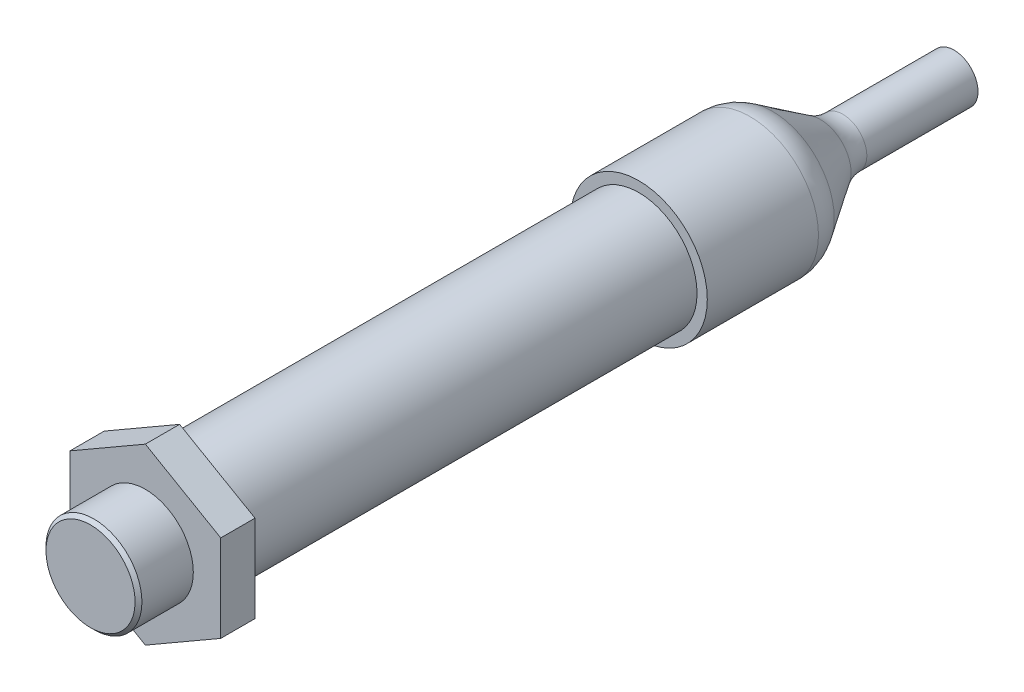
ISO-10303-21;
HEADER;
FILE_DESCRIPTION(('STEP AP214'),'2;1');
FILE_NAME('part.step','',(''),(''),'','','');
FILE_SCHEMA(('AUTOMOTIVE_DESIGN { 1 0 10303 214 1 1 1 1 }'));
ENDSEC;
DATA;
#1=APPLICATION_CONTEXT('core data for automotive mechanical design processes');
#2=APPLICATION_PROTOCOL_DEFINITION('international standard','automotive_design',2000,#1);
#3=PRODUCT_CONTEXT('',#1,'mechanical');
#4=PRODUCT('Part','Part','',(#3));
#5=PRODUCT_RELATED_PRODUCT_CATEGORY('part','',(#4));
#6=PRODUCT_DEFINITION_FORMATION('','',#4);
#7=PRODUCT_DEFINITION_CONTEXT('part definition',#1,'design');
#8=PRODUCT_DEFINITION('design','',#6,#7);
#9=PRODUCT_DEFINITION_SHAPE('','',#8);
#10=(LENGTH_UNIT() NAMED_UNIT(*) SI_UNIT(.MILLI.,.METRE.));
#11=(NAMED_UNIT(*) PLANE_ANGLE_UNIT() SI_UNIT($,.RADIAN.));
#12=(NAMED_UNIT(*) SI_UNIT($,.STERADIAN.) SOLID_ANGLE_UNIT());
#13=UNCERTAINTY_MEASURE_WITH_UNIT(LENGTH_MEASURE(1.E-05),#10,'distance_accuracy_value','');
#14=(GEOMETRIC_REPRESENTATION_CONTEXT(3) GLOBAL_UNCERTAINTY_ASSIGNED_CONTEXT((#13)) GLOBAL_UNIT_ASSIGNED_CONTEXT((#10,
#11,#12)) REPRESENTATION_CONTEXT('',''));
#15=CARTESIAN_POINT('',(0.,0.,0.));
#16=DIRECTION('',(0.,0.,1.));
#17=DIRECTION('',(1.,0.,0.));
#18=AXIS2_PLACEMENT_3D('',#15,#16,#17);
#19=CARTESIAN_POINT('',(474.760652388511,-976.019503363955,-1079.48043119511));
#20=DIRECTION('',(0.,0.,1.));
#21=DIRECTION('',(1.,0.,0.));
#22=AXIS2_PLACEMENT_3D('',#19,#20,#21);
#23=PLANE('',#22);
#24=CARTESIAN_POINT('',(476.510652388511,-976.019503363955,-1079.48043119511));
#25=DIRECTION('',(0.,0.,1.));
#26=DIRECTION('',(1.,0.,0.));
#27=AXIS2_PLACEMENT_3D('',#24,#25,#26);
#28=CIRCLE('',#27,3.5);
#29=CARTESIAN_POINT('',(480.010652388511,-976.019503363955,-1079.48043119511));
#30=VERTEX_POINT('',#29);
#31=EDGE_CURVE('E20',#30,#30,#28,.T.);
#32=ORIENTED_EDGE('',*,*,#31,.F.);
#33=EDGE_LOOP('',(#32));
#34=FACE_BOUND('',#33,.T.);
#35=ADVANCED_FACE('F17',(#34),#23,.F.);
#36=CARTESIAN_POINT('',(476.510652388511,-976.019503363955,-1070.48043119511));
#37=DIRECTION('',(0.,0.,1.));
#38=DIRECTION('',(1.,0.,0.));
#39=AXIS2_PLACEMENT_3D('',#36,#37,#38);
#40=CYLINDRICAL_SURFACE('',#39,3.5);
#41=CARTESIAN_POINT('',(476.510652388511,-976.019503363955,-1063.259071603));
#42=DIRECTION('',(0.,0.,1.));
#43=DIRECTION('',(1.,0.,0.));
#44=AXIS2_PLACEMENT_3D('',#41,#42,#43);
#45=CIRCLE('',#44,3.5);
#46=CARTESIAN_POINT('',(480.010652388511,-976.019503363955,-1063.259071603));
#47=VERTEX_POINT('',#46);
#48=EDGE_CURVE('E192',#47,#47,#45,.F.);
#49=ORIENTED_EDGE('',*,*,#48,.T.);
#50=EDGE_LOOP('',(#49));
#51=FACE_BOUND('',#50,.T.);
#52=ORIENTED_EDGE('',*,*,#31,.T.);
#53=EDGE_LOOP('',(#52));
#54=FACE_BOUND('',#53,.T.);
#55=ADVANCED_FACE('F119',(#51,#54),#40,.T.);
#56=CARTESIAN_POINT('',(473.010652388511,-976.019503363955,-953.480431195112));
#57=DIRECTION('',(0.,0.,1.));
#58=DIRECTION('',(1.,0.,0.));
#59=AXIS2_PLACEMENT_3D('',#56,#57,#58);
#60=PLANE('',#59);
#61=CARTESIAN_POINT('',(476.510652388511,-976.019503363955,-953.480431195105));
#62=DIRECTION('',(0.,0.,-1.));
#63=DIRECTION('',(0.,1.,0.));
#64=AXIS2_PLACEMENT_3D('',#61,#62,#63);
#65=CIRCLE('',#64,6.50000000001683);
#66=CARTESIAN_POINT('',(476.510652388511,-969.519503363938,-953.480431195105));
#67=VERTEX_POINT('',#66);
#68=EDGE_CURVE('E190',#67,#67,#65,.T.);
#69=ORIENTED_EDGE('',*,*,#68,.F.);
#70=EDGE_LOOP('',(#69));
#71=FACE_BOUND('',#70,.T.);
#72=ADVANCED_FACE('F115',(#71),#60,.T.);
#73=CARTESIAN_POINT('',(476.510652388511,-976.019503363955,-1063.259071603));
#74=DIRECTION('',(0.,0.,1.));
#75=DIRECTION('',(1.,0.,0.));
#76=AXIS2_PLACEMENT_3D('',#73,#74,#75);
#77=TOROIDAL_SURFACE('',#76,9.50000000000001,6.);
#78=CARTESIAN_POINT('',(476.510652388511,-976.019503363955,-1059.98914149943));
#79=DIRECTION('',(0.,0.,1.));
#80=DIRECTION('',(1.,0.,0.));
#81=AXIS2_PLACEMENT_3D('',#78,#79,#80);
#82=CIRCLE('',#81,4.46933830219326);
#83=CARTESIAN_POINT('',(480.979990690704,-976.019503363955,-1059.98914149943));
#84=VERTEX_POINT('',#83);
#85=EDGE_CURVE('E105',#84,#84,#82,.T.);
#86=ORIENTED_EDGE('',*,*,#85,.F.);
#87=EDGE_LOOP('',(#86));
#88=FACE_BOUND('',#87,.T.);
#89=ORIENTED_EDGE('',*,*,#48,.F.);
#90=EDGE_LOOP('',(#89));
#91=FACE_BOUND('',#90,.T.);
#92=ADVANCED_FACE('F110',(#88,#91),#77,.F.);
#93=CARTESIAN_POINT('',(476.510652388511,-976.019503363955,-953.980431195077));
#94=DIRECTION('',(0.,0.,-1.));
#95=DIRECTION('',(0.,1.,0.));
#96=AXIS2_PLACEMENT_3D('',#93,#94,#95);
#97=CONICAL_SURFACE('',#96,7.00000000004636,0.785398163454292);
#98=CARTESIAN_POINT('',(476.510652388511,-976.019503363955,-953.980431195112));
#99=DIRECTION('',(0.,0.,1.));
#100=DIRECTION('',(1.,0.,0.));
#101=AXIS2_PLACEMENT_3D('',#98,#99,#100);
#102=CIRCLE('',#101,7.);
#103=CARTESIAN_POINT('',(483.510652388511,-976.019503363955,-953.980431195112));
#104=VERTEX_POINT('',#103);
#105=EDGE_CURVE('E102',#104,#104,#102,.F.);
#106=ORIENTED_EDGE('',*,*,#105,.F.);
#107=EDGE_LOOP('',(#106));
#108=FACE_BOUND('',#107,.T.);
#109=ORIENTED_EDGE('',*,*,#68,.T.);
#110=EDGE_LOOP('',(#109));
#111=FACE_BOUND('',#110,.T.);
#112=ADVANCED_FACE('F114',(#108,#111),#97,.T.);
#113=CARTESIAN_POINT('',(476.510652388511,-976.019503363955,-1052.9717208908));
#114=DIRECTION('',(0.,0.,1.));
#115=DIRECTION('',(1.,0.,0.));
#116=AXIS2_PLACEMENT_3D('',#113,#114,#115);
#117=CONICAL_SURFACE('',#116,9.03066169780226,0.576375220591184);
#118=CARTESIAN_POINT('',(476.510652388511,-976.019503363955,-1052.9717208908));
#119=DIRECTION('',(0.,0.,1.));
#120=DIRECTION('',(1.,0.,0.));
#121=AXIS2_PLACEMENT_3D('',#118,#119,#120);
#122=CIRCLE('',#121,9.03066169780477);
#123=CARTESIAN_POINT('',(485.541314086316,-976.019503363955,-1052.9717208908));
#124=VERTEX_POINT('',#123);
#125=EDGE_CURVE('E99',#124,#124,#122,.T.);
#126=ORIENTED_EDGE('',*,*,#125,.F.);
#127=EDGE_LOOP('',(#126));
#128=FACE_BOUND('',#127,.T.);
#129=ORIENTED_EDGE('',*,*,#85,.T.);
#130=EDGE_LOOP('',(#129));
#131=FACE_BOUND('',#130,.T.);
#132=ADVANCED_FACE('F178',(#128,#131),#117,.T.);
#133=CARTESIAN_POINT('',(476.510652388511,-976.019503363955,-957.480431195112));
#134=DIRECTION('',(0.,0.,1.));
#135=DIRECTION('',(1.,0.,0.));
#136=AXIS2_PLACEMENT_3D('',#133,#134,#135);
#137=CYLINDRICAL_SURFACE('',#136,7.);
#138=ORIENTED_EDGE('',*,*,#105,.T.);
#139=EDGE_LOOP('',(#138));
#140=FACE_BOUND('',#139,.T.);
#141=CARTESIAN_POINT('',(476.510652388511,-976.019503363955,-961.480431195112));
#142=DIRECTION('',(0.,0.,1.));
#143=DIRECTION('',(1.,0.,0.));
#144=AXIS2_PLACEMENT_3D('',#141,#142,#143);
#145=CIRCLE('',#144,7.);
#146=CARTESIAN_POINT('',(483.510652388511,-976.019503363955,-961.480431195112));
#147=VERTEX_POINT('',#146);
#148=EDGE_CURVE('E98',#147,#147,#145,.F.);
#149=ORIENTED_EDGE('',*,*,#148,.F.);
#150=EDGE_LOOP('',(#149));
#151=FACE_BOUND('',#150,.T.);
#152=ADVANCED_FACE('F175',(#140,#151),#137,.T.);
#153=CARTESIAN_POINT('',(476.510652388511,-976.019503363955,-1049.70179078723));
#154=DIRECTION('',(0.,0.,1.));
#155=DIRECTION('',(1.,0.,0.));
#156=AXIS2_PLACEMENT_3D('',#153,#154,#155);
#157=DEGENERATE_TOROIDAL_SURFACE('',#156,4.,6.,.T.);
#158=CARTESIAN_POINT('',(476.510652388511,-976.019503363955,-1049.70179078723));
#159=DIRECTION('',(0.,0.,1.));
#160=DIRECTION('',(1.,0.,0.));
#161=AXIS2_PLACEMENT_3D('',#158,#159,#160);
#162=CIRCLE('',#161,10.);
#163=CARTESIAN_POINT('',(486.510652388511,-976.019503363955,-1049.70179078723));
#164=VERTEX_POINT('',#163);
#165=EDGE_CURVE('E78',#164,#164,#162,.T.);
#166=ORIENTED_EDGE('',*,*,#165,.F.);
#167=EDGE_LOOP('',(#166));
#168=FACE_BOUND('',#167,.T.);
#169=ORIENTED_EDGE('',*,*,#125,.T.);
#170=EDGE_LOOP('',(#169));
#171=FACE_BOUND('',#170,.T.);
#172=ADVANCED_FACE('F171',(#168,#171),#157,.T.);
#173=CARTESIAN_POINT('',(468.010652388511,-976.019503363955,-961.480431195112));
#174=DIRECTION('',(0.,0.,1.));
#175=DIRECTION('',(1.,0.,0.));
#176=AXIS2_PLACEMENT_3D('',#173,#174,#175);
#177=PLANE('',#176);
#178=ORIENTED_EDGE('',*,*,#148,.T.);
#179=EDGE_LOOP('',(#178));
#180=FACE_BOUND('',#179,.T.);
#181=DIRECTION('',(-0.866025403784439,-0.5,0.));
#182=VECTOR('',#181,1.);
#183=CARTESIAN_POINT('',(487.510652388511,-982.370356325041,-961.480431195112));
#184=LINE('',#183,#182);
#185=CARTESIAN_POINT('',(476.510652388511,-988.721209286126,-961.480431195112));
#186=VERTEX_POINT('',#185);
#187=CARTESIAN_POINT('',(487.510652388511,-982.370356325041,-961.480431195112));
#188=VERTEX_POINT('',#187);
#189=EDGE_CURVE('E224',#186,#188,#184,.F.);
#190=ORIENTED_EDGE('',*,*,#189,.T.);
#191=DIRECTION('',(0.,1.,0.));
#192=VECTOR('',#191,1.);
#193=CARTESIAN_POINT('',(487.510652388511,-969.668650402869,-961.480431195112));
#194=LINE('',#193,#192);
#195=CARTESIAN_POINT('',(487.510652388511,-969.668650402869,-961.480431195112));
#196=VERTEX_POINT('',#195);
#197=EDGE_CURVE('E75',#188,#196,#194,.T.);
#198=ORIENTED_EDGE('',*,*,#197,.T.);
#199=DIRECTION('',(0.866025403784439,-0.5,0.));
#200=VECTOR('',#199,1.);
#201=CARTESIAN_POINT('',(476.510652388511,-963.317797441783,-961.480431195112));
#202=LINE('',#201,#200);
#203=CARTESIAN_POINT('',(476.510652388511,-963.317797441783,-961.480431195112));
#204=VERTEX_POINT('',#203);
#205=EDGE_CURVE('E71',#196,#204,#202,.F.);
#206=ORIENTED_EDGE('',*,*,#205,.T.);
#207=DIRECTION('',(0.866025403784439,0.5,0.));
#208=VECTOR('',#207,1.);
#209=CARTESIAN_POINT('',(465.510652388511,-969.668650402869,-961.480431195112));
#210=LINE('',#209,#208);
#211=CARTESIAN_POINT('',(465.510652388511,-969.668650402869,-961.480431195112));
#212=VERTEX_POINT('',#211);
#213=EDGE_CURVE('E68',#204,#212,#210,.F.);
#214=ORIENTED_EDGE('',*,*,#213,.T.);
#215=DIRECTION('',(0.,1.,0.));
#216=VECTOR('',#215,1.);
#217=CARTESIAN_POINT('',(465.510652388511,-982.370356325041,-961.480431195112));
#218=LINE('',#217,#216);
#219=CARTESIAN_POINT('',(465.510652388511,-982.370356325041,-961.480431195112));
#220=VERTEX_POINT('',#219);
#221=EDGE_CURVE('E87',#212,#220,#218,.F.);
#222=ORIENTED_EDGE('',*,*,#221,.T.);
#223=DIRECTION('',(-0.866025403784439,0.5,0.));
#224=VECTOR('',#223,1.);
#225=CARTESIAN_POINT('',(476.510652388511,-988.721209286126,-961.480431195112));
#226=LINE('',#225,#224);
#227=EDGE_CURVE('E229',#220,#186,#226,.F.);
#228=ORIENTED_EDGE('',*,*,#227,.T.);
#229=EDGE_LOOP('',(#190,#198,#206,#214,#222,#228));
#230=FACE_BOUND('',#229,.T.);
#231=ADVANCED_FACE('F73',(#180,#230),#177,.T.);
#232=CARTESIAN_POINT('',(476.510652388511,-976.019503363955,-1042.48043119511));
#233=DIRECTION('',(0.,0.,1.));
#234=DIRECTION('',(1.,0.,0.));
#235=AXIS2_PLACEMENT_3D('',#232,#233,#234);
#236=CYLINDRICAL_SURFACE('',#235,10.);
#237=CARTESIAN_POINT('',(476.510652388511,-976.019503363955,-1033.48043119511));
#238=DIRECTION('',(0.,0.,1.));
#239=DIRECTION('',(1.,0.,0.));
#240=AXIS2_PLACEMENT_3D('',#237,#238,#239);
#241=CIRCLE('',#240,10.);
#242=CARTESIAN_POINT('',(486.510652388511,-976.019503363955,-1033.48043119511));
#243=VERTEX_POINT('',#242);
#244=EDGE_CURVE('E198',#243,#243,#241,.T.);
#245=ORIENTED_EDGE('',*,*,#244,.F.);
#246=EDGE_LOOP('',(#245));
#247=FACE_BOUND('',#246,.T.);
#248=ORIENTED_EDGE('',*,*,#165,.T.);
#249=EDGE_LOOP('',(#248));
#250=FACE_BOUND('',#249,.T.);
#251=ADVANCED_FACE('F165',(#247,#250),#236,.T.);
#252=CARTESIAN_POINT('',(476.510652388511,-963.317797441783,-961.480431195112));
#253=DIRECTION('',(-0.5,-0.866025403784439,0.));
#254=DIRECTION('',(0.866025403784439,-0.5,0.));
#255=AXIS2_PLACEMENT_3D('',#252,#253,#254);
#256=PLANE('',#255);
#257=DIRECTION('',(-0.866025403784432,0.500000000000012,0.));
#258=VECTOR('',#257,1.);
#259=CARTESIAN_POINT('',(487.510652388511,-969.668650402869,-966.480431195112));
#260=LINE('',#259,#258);
#261=CARTESIAN_POINT('',(487.510652388511,-969.668650402869,-966.480431195112));
#262=VERTEX_POINT('',#261);
#263=CARTESIAN_POINT('',(476.510652388511,-963.317797441783,-966.480431195112));
#264=VERTEX_POINT('',#263);
#265=EDGE_CURVE('E84',#262,#264,#260,.T.);
#266=ORIENTED_EDGE('',*,*,#265,.T.);
#267=DIRECTION('',(0.,0.,1.));
#268=VECTOR('',#267,1.);
#269=CARTESIAN_POINT('',(476.510652388511,-963.317797441783,-961.480431195112));
#270=LINE('',#269,#268);
#271=EDGE_CURVE('E81',#264,#204,#270,.T.);
#272=ORIENTED_EDGE('',*,*,#271,.T.);
#273=ORIENTED_EDGE('',*,*,#205,.F.);
#274=DIRECTION('',(0.,0.,1.));
#275=VECTOR('',#274,1.);
#276=CARTESIAN_POINT('',(487.510652388511,-969.668650402869,-961.480431195112));
#277=LINE('',#276,#275);
#278=EDGE_CURVE('E218',#196,#262,#277,.F.);
#279=ORIENTED_EDGE('',*,*,#278,.T.);
#280=EDGE_LOOP('',(#266,#272,#273,#279));
#281=FACE_BOUND('',#280,.T.);
#282=ADVANCED_FACE('F82',(#281),#256,.F.);
#283=CARTESIAN_POINT('',(465.510652388511,-969.668650402869,-961.480431195112));
#284=DIRECTION('',(0.5,-0.866025403784439,0.));
#285=DIRECTION('',(0.866025403784439,0.5,0.));
#286=AXIS2_PLACEMENT_3D('',#283,#284,#285);
#287=PLANE('',#286);
#288=DIRECTION('',(-0.866025403784433,-0.50000000000001,0.));
#289=VECTOR('',#288,1.);
#290=CARTESIAN_POINT('',(476.510652388511,-963.317797441783,-966.480431195112));
#291=LINE('',#290,#289);
#292=CARTESIAN_POINT('',(465.510652388511,-969.668650402869,-966.480431195112));
#293=VERTEX_POINT('',#292);
#294=EDGE_CURVE('E214',#264,#293,#291,.T.);
#295=ORIENTED_EDGE('',*,*,#294,.T.);
#296=DIRECTION('',(0.,0.,1.));
#297=VECTOR('',#296,1.);
#298=CARTESIAN_POINT('',(465.510652388511,-969.668650402869,-961.480431195112));
#299=LINE('',#298,#297);
#300=EDGE_CURVE('E91',#293,#212,#299,.T.);
#301=ORIENTED_EDGE('',*,*,#300,.T.);
#302=ORIENTED_EDGE('',*,*,#213,.F.);
#303=ORIENTED_EDGE('',*,*,#271,.F.);
#304=EDGE_LOOP('',(#295,#301,#302,#303));
#305=FACE_BOUND('',#304,.T.);
#306=ADVANCED_FACE('F89',(#305),#287,.F.);
#307=CARTESIAN_POINT('',(465.510652388511,-982.370356325041,-961.480431195112));
#308=DIRECTION('',(1.,0.,0.));
#309=DIRECTION('',(0.,1.,0.));
#310=AXIS2_PLACEMENT_3D('',#307,#308,#309);
#311=PLANE('',#310);
#312=DIRECTION('',(0.,1.,0.));
#313=VECTOR('',#312,1.);
#314=CARTESIAN_POINT('',(465.510652388511,-976.019503363955,-966.480431195112));
#315=LINE('',#314,#313);
#316=CARTESIAN_POINT('',(465.510652388511,-982.370356325041,-966.480431195112));
#317=VERTEX_POINT('',#316);
#318=EDGE_CURVE('E212',#293,#317,#315,.F.);
#319=ORIENTED_EDGE('',*,*,#318,.T.);
#320=DIRECTION('',(0.,0.,1.));
#321=VECTOR('',#320,1.);
#322=CARTESIAN_POINT('',(465.510652388511,-982.37035632504,-961.480431195112));
#323=LINE('',#322,#321);
#324=EDGE_CURVE('E226',#317,#220,#323,.T.);
#325=ORIENTED_EDGE('',*,*,#324,.T.);
#326=ORIENTED_EDGE('',*,*,#221,.F.);
#327=ORIENTED_EDGE('',*,*,#300,.F.);
#328=EDGE_LOOP('',(#319,#325,#326,#327));
#329=FACE_BOUND('',#328,.T.);
#330=ADVANCED_FACE('F156',(#329),#311,.F.);
#331=CARTESIAN_POINT('',(476.510652388511,-988.721209286126,-961.480431195112));
#332=DIRECTION('',(0.5,0.866025403784439,0.));
#333=DIRECTION('',(-0.866025403784439,0.5,0.));
#334=AXIS2_PLACEMENT_3D('',#331,#332,#333);
#335=PLANE('',#334);
#336=DIRECTION('',(0.866025403784452,-0.499999999999976,0.));
#337=VECTOR('',#336,1.);
#338=CARTESIAN_POINT('',(465.510652388511,-982.37035632504,-966.480431195112));
#339=LINE('',#338,#337);
#340=CARTESIAN_POINT('',(476.510652388512,-988.721209286126,-966.480431195112));
#341=VERTEX_POINT('',#340);
#342=EDGE_CURVE('E208',#317,#341,#339,.T.);
#343=ORIENTED_EDGE('',*,*,#342,.T.);
#344=DIRECTION('',(0.,0.,1.));
#345=VECTOR('',#344,1.);
#346=CARTESIAN_POINT('',(476.510652388512,-988.721209286126,-961.480431195112));
#347=LINE('',#346,#345);
#348=EDGE_CURVE('E221',#341,#186,#347,.T.);
#349=ORIENTED_EDGE('',*,*,#348,.T.);
#350=ORIENTED_EDGE('',*,*,#227,.F.);
#351=ORIENTED_EDGE('',*,*,#324,.F.);
#352=EDGE_LOOP('',(#343,#349,#350,#351));
#353=FACE_BOUND('',#352,.T.);
#354=ADVANCED_FACE('F153',(#353),#335,.F.);
#355=CARTESIAN_POINT('',(487.510652388511,-982.370356325041,-961.480431195112));
#356=DIRECTION('',(-0.5,0.866025403784439,0.));
#357=DIRECTION('',(-0.866025403784439,-0.5,0.));
#358=AXIS2_PLACEMENT_3D('',#355,#356,#357);
#359=PLANE('',#358);
#360=DIRECTION('',(0.86602540378445,0.499999999999981,0.));
#361=VECTOR('',#360,1.);
#362=CARTESIAN_POINT('',(476.510652388512,-988.721209286126,-966.480431195112));
#363=LINE('',#362,#361);
#364=CARTESIAN_POINT('',(487.510652388511,-982.370356325041,-966.480431195112));
#365=VERTEX_POINT('',#364);
#366=EDGE_CURVE('E35',#341,#365,#363,.T.);
#367=ORIENTED_EDGE('',*,*,#366,.T.);
#368=DIRECTION('',(0.,0.,1.));
#369=VECTOR('',#368,1.);
#370=CARTESIAN_POINT('',(487.510652388511,-982.370356325041,-961.480431195112));
#371=LINE('',#370,#369);
#372=EDGE_CURVE('E201',#365,#188,#371,.T.);
#373=ORIENTED_EDGE('',*,*,#372,.T.);
#374=ORIENTED_EDGE('',*,*,#189,.F.);
#375=ORIENTED_EDGE('',*,*,#348,.F.);
#376=EDGE_LOOP('',(#367,#373,#374,#375));
#377=FACE_BOUND('',#376,.T.);
#378=ADVANCED_FACE('F149',(#377),#359,.F.);
#379=CARTESIAN_POINT('',(487.510652388511,-969.668650402869,-961.480431195112));
#380=DIRECTION('',(-1.,0.,0.));
#381=DIRECTION('',(0.,0.,1.));
#382=AXIS2_PLACEMENT_3D('',#379,#380,#381);
#383=PLANE('',#382);
#384=DIRECTION('',(0.,1.,0.));
#385=VECTOR('',#384,1.);
#386=CARTESIAN_POINT('',(487.510652388511,-976.019503363955,-966.480431195112));
#387=LINE('',#386,#385);
#388=EDGE_CURVE('E203',#365,#262,#387,.T.);
#389=ORIENTED_EDGE('',*,*,#388,.T.);
#390=ORIENTED_EDGE('',*,*,#278,.F.);
#391=ORIENTED_EDGE('',*,*,#197,.F.);
#392=ORIENTED_EDGE('',*,*,#372,.F.);
#393=EDGE_LOOP('',(#389,#390,#391,#392));
#394=FACE_BOUND('',#393,.T.);
#395=ADVANCED_FACE('F145',(#394),#383,.F.);
#396=CARTESIAN_POINT('',(467.260652388511,-976.019503363955,-1033.48043119511));
#397=DIRECTION('',(0.,0.,1.));
#398=DIRECTION('',(1.,0.,0.));
#399=AXIS2_PLACEMENT_3D('',#396,#397,#398);
#400=PLANE('',#399);
#401=ORIENTED_EDGE('',*,*,#244,.T.);
#402=EDGE_LOOP('',(#401));
#403=FACE_BOUND('',#402,.T.);
#404=CARTESIAN_POINT('',(476.510652388511,-976.019503363955,-1033.48043119511));
#405=DIRECTION('',(0.,0.,1.));
#406=DIRECTION('',(1.,0.,0.));
#407=AXIS2_PLACEMENT_3D('',#404,#405,#406);
#408=CIRCLE('',#407,8.5);
#409=CARTESIAN_POINT('',(485.010652388511,-976.019503363955,-1033.48043119511));
#410=VERTEX_POINT('',#409);
#411=EDGE_CURVE('E26',#410,#410,#408,.T.);
#412=ORIENTED_EDGE('',*,*,#411,.F.);
#413=EDGE_LOOP('',(#412));
#414=FACE_BOUND('',#413,.T.);
#415=ADVANCED_FACE('F138',(#403,#414),#400,.T.);
#416=CARTESIAN_POINT('',(467.260652388511,-976.019503363955,-966.480431195112));
#417=DIRECTION('',(0.,0.,1.));
#418=DIRECTION('',(1.,0.,0.));
#419=AXIS2_PLACEMENT_3D('',#416,#417,#418);
#420=PLANE('',#419);
#421=ORIENTED_EDGE('',*,*,#366,.F.);
#422=ORIENTED_EDGE('',*,*,#342,.F.);
#423=ORIENTED_EDGE('',*,*,#318,.F.);
#424=ORIENTED_EDGE('',*,*,#294,.F.);
#425=ORIENTED_EDGE('',*,*,#265,.F.);
#426=ORIENTED_EDGE('',*,*,#388,.F.);
#427=EDGE_LOOP('',(#421,#422,#423,#424,#425,#426));
#428=FACE_BOUND('',#427,.T.);
#429=CARTESIAN_POINT('',(476.510652388511,-976.019503363955,-966.480431195112));
#430=DIRECTION('',(0.,0.,1.));
#431=DIRECTION('',(1.,0.,0.));
#432=AXIS2_PLACEMENT_3D('',#429,#430,#431);
#433=CIRCLE('',#432,8.5);
#434=CARTESIAN_POINT('',(485.010652388511,-976.019503363955,-966.480431195112));
#435=VERTEX_POINT('',#434);
#436=EDGE_CURVE('E11',#435,#435,#433,.F.);
#437=ORIENTED_EDGE('',*,*,#436,.F.);
#438=EDGE_LOOP('',(#437));
#439=FACE_BOUND('',#438,.T.);
#440=ADVANCED_FACE('F132',(#428,#439),#420,.F.);
#441=CARTESIAN_POINT('',(476.510652388511,-976.019503363955,-973.980431195112));
#442=DIRECTION('',(0.,0.,1.));
#443=DIRECTION('',(1.,0.,0.));
#444=AXIS2_PLACEMENT_3D('',#441,#442,#443);
#445=CYLINDRICAL_SURFACE('',#444,8.5);
#446=ORIENTED_EDGE('',*,*,#436,.T.);
#447=EDGE_LOOP('',(#446));
#448=FACE_BOUND('',#447,.T.);
#449=ORIENTED_EDGE('',*,*,#411,.T.);
#450=EDGE_LOOP('',(#449));
#451=FACE_BOUND('',#450,.T.);
#452=ADVANCED_FACE('F130',(#448,#451),#445,.T.);
#453=CLOSED_SHELL('',(#35,#55,#72,#92,#112,#132,#152,#172,#231,#251,#282,#306,#330,#354,#378,
#395,#415,#440,#452));
#454=MANIFOLD_SOLID_BREP('B1',#453);
#455=ADVANCED_BREP_SHAPE_REPRESENTATION('',(#18,#454),#14);
#456=SHAPE_DEFINITION_REPRESENTATION(#9,#455);
ENDSEC;
END-ISO-10303-21;
